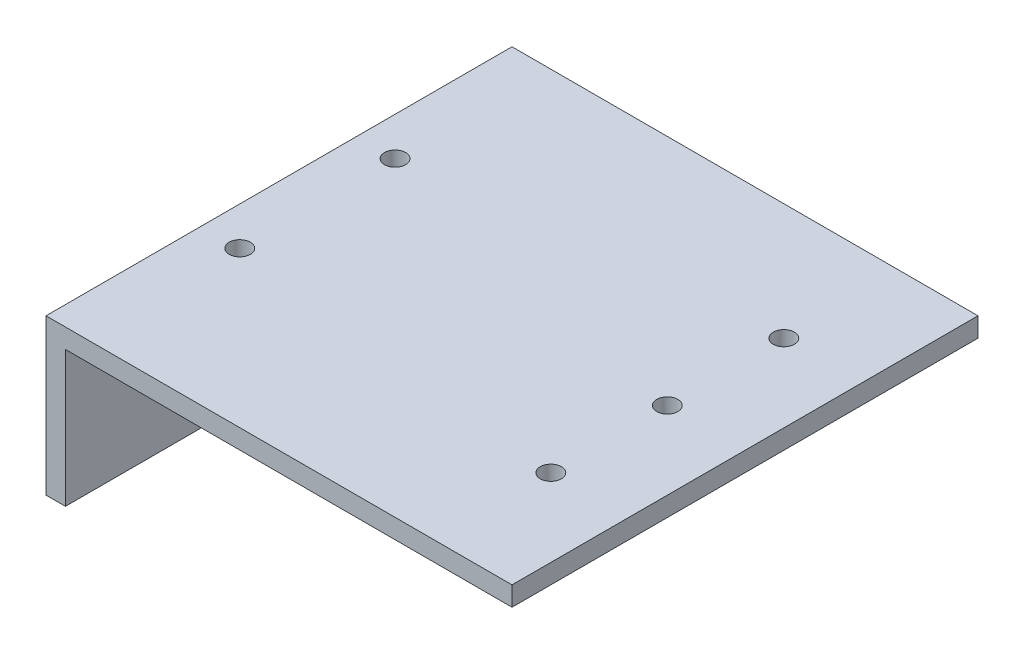
ISO-10303-21;
HEADER;
FILE_DESCRIPTION(('STEP AP214'),'2;1');
FILE_NAME('part.step','',(''),(''),'','','');
FILE_SCHEMA(('AUTOMOTIVE_DESIGN { 1 0 10303 214 1 1 1 1 }'));
ENDSEC;
DATA;
#1=APPLICATION_CONTEXT('core data for automotive mechanical design processes');
#2=APPLICATION_PROTOCOL_DEFINITION('international standard','automotive_design',2000,#1);
#3=PRODUCT_CONTEXT('',#1,'mechanical');
#4=PRODUCT('Part','Part','',(#3));
#5=PRODUCT_RELATED_PRODUCT_CATEGORY('part','',(#4));
#6=PRODUCT_DEFINITION_FORMATION('','',#4);
#7=PRODUCT_DEFINITION_CONTEXT('part definition',#1,'design');
#8=PRODUCT_DEFINITION('design','',#6,#7);
#9=PRODUCT_DEFINITION_SHAPE('','',#8);
#10=(LENGTH_UNIT() NAMED_UNIT(*) SI_UNIT(.MILLI.,.METRE.));
#11=(NAMED_UNIT(*) PLANE_ANGLE_UNIT() SI_UNIT($,.RADIAN.));
#12=(NAMED_UNIT(*) SI_UNIT($,.STERADIAN.) SOLID_ANGLE_UNIT());
#13=UNCERTAINTY_MEASURE_WITH_UNIT(LENGTH_MEASURE(1.E-05),#10,'distance_accuracy_value','');
#14=(GEOMETRIC_REPRESENTATION_CONTEXT(3) GLOBAL_UNCERTAINTY_ASSIGNED_CONTEXT((#13)) GLOBAL_UNIT_ASSIGNED_CONTEXT((#10,
#11,#12)) REPRESENTATION_CONTEXT('',''));
#15=CARTESIAN_POINT('',(0.,0.,0.));
#16=DIRECTION('',(0.,0.,1.));
#17=DIRECTION('',(1.,0.,0.));
#18=AXIS2_PLACEMENT_3D('',#15,#16,#17);
#19=CARTESIAN_POINT('',(0.,-3.17500000000001,76.2));
#20=DIRECTION('',(-1.,0.,0.));
#21=DIRECTION('',(0.,0.,1.));
#22=AXIS2_PLACEMENT_3D('',#19,#20,#21);
#23=PLANE('',#22);
#24=DIRECTION('',(0.,1.,0.));
#25=VECTOR('',#24,1.);
#26=CARTESIAN_POINT('',(0.,-3.17500000000001,0.));
#27=LINE('',#26,#25);
#28=CARTESIAN_POINT('',(0.,-3.17500000000001,0.));
#29=VERTEX_POINT('',#28);
#30=CARTESIAN_POINT('',(0.,0.,0.));
#31=VERTEX_POINT('',#30);
#32=EDGE_CURVE('E172',#29,#31,#27,.T.);
#33=ORIENTED_EDGE('',*,*,#32,.T.);
#34=DIRECTION('',(0.,0.,-1.));
#35=VECTOR('',#34,1.);
#36=CARTESIAN_POINT('',(0.,0.,76.2));
#37=LINE('',#36,#35);
#38=CARTESIAN_POINT('',(0.,0.,76.2));
#39=VERTEX_POINT('',#38);
#40=EDGE_CURVE('E11',#39,#31,#37,.T.);
#41=ORIENTED_EDGE('',*,*,#40,.F.);
#42=DIRECTION('',(0.,1.,0.));
#43=VECTOR('',#42,1.);
#44=CARTESIAN_POINT('',(0.,-3.17500000000001,76.2));
#45=LINE('',#44,#43);
#46=CARTESIAN_POINT('',(0.,-3.17500000000001,76.2));
#47=VERTEX_POINT('',#46);
#48=EDGE_CURVE('E173',#47,#39,#45,.T.);
#49=ORIENTED_EDGE('',*,*,#48,.F.);
#50=DIRECTION('',(0.,0.,-1.));
#51=VECTOR('',#50,1.);
#52=CARTESIAN_POINT('',(0.,-3.17500000000001,76.2));
#53=LINE('',#52,#51);
#54=EDGE_CURVE('E187',#47,#29,#53,.T.);
#55=ORIENTED_EDGE('',*,*,#54,.T.);
#56=EDGE_LOOP('',(#33,#41,#49,#55));
#57=FACE_BOUND('',#56,.T.);
#58=ADVANCED_FACE('F34',(#57),#23,.F.);
#59=CARTESIAN_POINT('',(0.,0.,76.2));
#60=DIRECTION('',(0.,-1.,0.));
#61=DIRECTION('',(1.,0.,0.));
#62=AXIS2_PLACEMENT_3D('',#59,#60,#61);
#63=PLANE('',#62);
#64=CARTESIAN_POINT('',(-12.7,0.,19.05));
#65=DIRECTION('',(0.,1.,0.));
#66=DIRECTION('',(0.,0.,1.));
#67=AXIS2_PLACEMENT_3D('',#64,#65,#66);
#68=CIRCLE('',#67,1.72719999999999);
#69=CARTESIAN_POINT('',(-12.7,0.,20.7772));
#70=VERTEX_POINT('',#69);
#71=EDGE_CURVE('E228',#70,#70,#68,.T.);
#72=ORIENTED_EDGE('',*,*,#71,.F.);
#73=EDGE_LOOP('',(#72));
#74=FACE_BOUND('',#73,.T.);
#75=CARTESIAN_POINT('',(-12.7,0.,38.1));
#76=DIRECTION('',(0.,1.,0.));
#77=DIRECTION('',(0.,0.,1.));
#78=AXIS2_PLACEMENT_3D('',#75,#76,#77);
#79=CIRCLE('',#78,1.72719999999999);
#80=CARTESIAN_POINT('',(-12.7,0.,39.8272));
#81=VERTEX_POINT('',#80);
#82=EDGE_CURVE('E221',#81,#81,#79,.T.);
#83=ORIENTED_EDGE('',*,*,#82,.F.);
#84=EDGE_LOOP('',(#83));
#85=FACE_BOUND('',#84,.T.);
#86=CARTESIAN_POINT('',(-12.7,0.,57.15));
#87=DIRECTION('',(0.,1.,0.));
#88=DIRECTION('',(0.,0.,1.));
#89=AXIS2_PLACEMENT_3D('',#86,#87,#88);
#90=CIRCLE('',#89,1.72719999999999);
#91=CARTESIAN_POINT('',(-12.7,0.,58.8772));
#92=VERTEX_POINT('',#91);
#93=EDGE_CURVE('E213',#92,#92,#90,.T.);
#94=ORIENTED_EDGE('',*,*,#93,.F.);
#95=EDGE_LOOP('',(#94));
#96=FACE_BOUND('',#95,.T.);
#97=CARTESIAN_POINT('',(-69.9177386123245,0.,25.4));
#98=DIRECTION('',(0.,1.,0.));
#99=DIRECTION('',(0.,0.,1.));
#100=AXIS2_PLACEMENT_3D('',#97,#98,#99);
#101=CIRCLE('',#100,1.7272);
#102=CARTESIAN_POINT('',(-69.9177386123245,0.,27.1272));
#103=VERTEX_POINT('',#102);
#104=EDGE_CURVE('E126',#103,#103,#101,.T.);
#105=ORIENTED_EDGE('',*,*,#104,.F.);
#106=EDGE_LOOP('',(#105));
#107=FACE_BOUND('',#106,.T.);
#108=CARTESIAN_POINT('',(-69.9177386123245,0.,50.8));
#109=DIRECTION('',(0.,1.,0.));
#110=DIRECTION('',(0.,0.,1.));
#111=AXIS2_PLACEMENT_3D('',#108,#109,#110);
#112=CIRCLE('',#111,1.7272);
#113=CARTESIAN_POINT('',(-69.9177386123245,0.,52.5272));
#114=VERTEX_POINT('',#113);
#115=EDGE_CURVE('E154',#114,#114,#112,.T.);
#116=ORIENTED_EDGE('',*,*,#115,.F.);
#117=EDGE_LOOP('',(#116));
#118=FACE_BOUND('',#117,.T.);
#119=DIRECTION('',(-1.,0.,0.));
#120=VECTOR('',#119,1.);
#121=CARTESIAN_POINT('',(0.,0.,0.));
#122=LINE('',#121,#120);
#123=CARTESIAN_POINT('',(-76.2,0.,0.));
#124=VERTEX_POINT('',#123);
#125=EDGE_CURVE('E190',#31,#124,#122,.T.);
#126=ORIENTED_EDGE('',*,*,#125,.T.);
#127=DIRECTION('',(0.,0.,-1.));
#128=VECTOR('',#127,1.);
#129=CARTESIAN_POINT('',(-76.2,0.,76.2));
#130=LINE('',#129,#128);
#131=CARTESIAN_POINT('',(-76.2,0.,76.2));
#132=VERTEX_POINT('',#131);
#133=EDGE_CURVE('E42',#132,#124,#130,.T.);
#134=ORIENTED_EDGE('',*,*,#133,.F.);
#135=DIRECTION('',(-1.,0.,0.));
#136=VECTOR('',#135,1.);
#137=CARTESIAN_POINT('',(0.,0.,76.2));
#138=LINE('',#137,#136);
#139=EDGE_CURVE('E176',#39,#132,#138,.T.);
#140=ORIENTED_EDGE('',*,*,#139,.F.);
#141=ORIENTED_EDGE('',*,*,#40,.T.);
#142=EDGE_LOOP('',(#126,#134,#140,#141));
#143=FACE_BOUND('',#142,.T.);
#144=ADVANCED_FACE('F235',(#74,#85,#96,#107,#118,#143),#63,.F.);
#145=CARTESIAN_POINT('',(-76.2,0.,76.2));
#146=DIRECTION('',(1.,0.,0.));
#147=DIRECTION('',(0.,0.,-1.));
#148=AXIS2_PLACEMENT_3D('',#145,#146,#147);
#149=PLANE('',#148);
#150=DIRECTION('',(0.,0.,-1.));
#151=VECTOR('',#150,1.);
#152=CARTESIAN_POINT('',(-76.2,-13.589,36.449));
#153=LINE('',#152,#151);
#154=CARTESIAN_POINT('',(-76.2,-13.589,39.751));
#155=VERTEX_POINT('',#154);
#156=CARTESIAN_POINT('',(-76.2,-13.589,36.449));
#157=VERTEX_POINT('',#156);
#158=EDGE_CURVE('E134',#155,#157,#153,.T.);
#159=ORIENTED_EDGE('',*,*,#158,.F.);
#160=DIRECTION('',(0.,1.,0.));
#161=VECTOR('',#160,1.);
#162=CARTESIAN_POINT('',(-76.2,-16.891,39.751));
#163=LINE('',#162,#161);
#164=CARTESIAN_POINT('',(-76.2,-16.891,39.751));
#165=VERTEX_POINT('',#164);
#166=EDGE_CURVE('E50',#165,#155,#163,.T.);
#167=ORIENTED_EDGE('',*,*,#166,.F.);
#168=DIRECTION('',(0.,0.,1.));
#169=VECTOR('',#168,1.);
#170=CARTESIAN_POINT('',(-76.2,-16.891,36.449));
#171=LINE('',#170,#169);
#172=CARTESIAN_POINT('',(-76.2,-16.891,36.449));
#173=VERTEX_POINT('',#172);
#174=EDGE_CURVE('E120',#173,#165,#171,.T.);
#175=ORIENTED_EDGE('',*,*,#174,.F.);
#176=DIRECTION('',(0.,-1.,0.));
#177=VECTOR('',#176,1.);
#178=CARTESIAN_POINT('',(-76.2,-16.891,36.449));
#179=LINE('',#178,#177);
#180=EDGE_CURVE('E140',#157,#173,#179,.T.);
#181=ORIENTED_EDGE('',*,*,#180,.F.);
#182=EDGE_LOOP('',(#159,#167,#175,#181));
#183=FACE_BOUND('',#182,.T.);
#184=CARTESIAN_POINT('',(-76.2,-15.24,25.4));
#185=DIRECTION('',(-1.,0.,0.));
#186=DIRECTION('',(0.,0.,1.));
#187=AXIS2_PLACEMENT_3D('',#184,#185,#186);
#188=CIRCLE('',#187,1.35255);
#189=CARTESIAN_POINT('',(-76.2,-15.24,26.75255));
#190=VERTEX_POINT('',#189);
#191=EDGE_CURVE('E160',#190,#190,#188,.T.);
#192=ORIENTED_EDGE('',*,*,#191,.F.);
#193=EDGE_LOOP('',(#192));
#194=FACE_BOUND('',#193,.T.);
#195=CARTESIAN_POINT('',(-76.2,-15.24,12.7));
#196=DIRECTION('',(-1.,0.,0.));
#197=DIRECTION('',(0.,0.,1.));
#198=AXIS2_PLACEMENT_3D('',#195,#196,#197);
#199=CIRCLE('',#198,1.35255);
#200=CARTESIAN_POINT('',(-76.2,-15.24,14.05255));
#201=VERTEX_POINT('',#200);
#202=EDGE_CURVE('E166',#201,#201,#199,.T.);
#203=ORIENTED_EDGE('',*,*,#202,.F.);
#204=EDGE_LOOP('',(#203));
#205=FACE_BOUND('',#204,.T.);
#206=DIRECTION('',(0.,-1.,0.));
#207=VECTOR('',#206,1.);
#208=CARTESIAN_POINT('',(-76.2,0.,0.));
#209=LINE('',#208,#207);
#210=CARTESIAN_POINT('',(-76.2,-25.4,0.));
#211=VERTEX_POINT('',#210);
#212=EDGE_CURVE('E192',#124,#211,#209,.T.);
#213=ORIENTED_EDGE('',*,*,#212,.T.);
#214=DIRECTION('',(0.,0.,-1.));
#215=VECTOR('',#214,1.);
#216=CARTESIAN_POINT('',(-76.2,-25.4,76.2));
#217=LINE('',#216,#215);
#218=CARTESIAN_POINT('',(-76.2,-25.4,76.2));
#219=VERTEX_POINT('',#218);
#220=EDGE_CURVE('E207',#219,#211,#217,.T.);
#221=ORIENTED_EDGE('',*,*,#220,.F.);
#222=DIRECTION('',(0.,-1.,0.));
#223=VECTOR('',#222,1.);
#224=CARTESIAN_POINT('',(-76.2,0.,76.2));
#225=LINE('',#224,#223);
#226=EDGE_CURVE('E179',#132,#219,#225,.T.);
#227=ORIENTED_EDGE('',*,*,#226,.F.);
#228=ORIENTED_EDGE('',*,*,#133,.T.);
#229=EDGE_LOOP('',(#213,#221,#227,#228));
#230=FACE_BOUND('',#229,.T.);
#231=ADVANCED_FACE('F238',(#183,#194,#205,#230),#149,.F.);
#232=CARTESIAN_POINT('',(-76.2,-25.4,76.2));
#233=DIRECTION('',(0.,1.,0.));
#234=DIRECTION('',(0.,0.,1.));
#235=AXIS2_PLACEMENT_3D('',#232,#233,#234);
#236=PLANE('',#235);
#237=DIRECTION('',(1.,0.,0.));
#238=VECTOR('',#237,1.);
#239=CARTESIAN_POINT('',(-76.2,-25.4,0.));
#240=LINE('',#239,#238);
#241=CARTESIAN_POINT('',(-73.025,-25.4,0.));
#242=VERTEX_POINT('',#241);
#243=EDGE_CURVE('E194',#211,#242,#240,.T.);
#244=ORIENTED_EDGE('',*,*,#243,.T.);
#245=DIRECTION('',(0.,0.,-1.));
#246=VECTOR('',#245,1.);
#247=CARTESIAN_POINT('',(-73.025,-25.4,76.2));
#248=LINE('',#247,#246);
#249=CARTESIAN_POINT('',(-73.025,-25.4,76.2));
#250=VERTEX_POINT('',#249);
#251=EDGE_CURVE('E204',#250,#242,#248,.T.);
#252=ORIENTED_EDGE('',*,*,#251,.F.);
#253=DIRECTION('',(1.,0.,0.));
#254=VECTOR('',#253,1.);
#255=CARTESIAN_POINT('',(-76.2,-25.4,76.2));
#256=LINE('',#255,#254);
#257=EDGE_CURVE('E181',#219,#250,#256,.T.);
#258=ORIENTED_EDGE('',*,*,#257,.F.);
#259=ORIENTED_EDGE('',*,*,#220,.T.);
#260=EDGE_LOOP('',(#244,#252,#258,#259));
#261=FACE_BOUND('',#260,.T.);
#262=ADVANCED_FACE('F260',(#261),#236,.F.);
#263=CARTESIAN_POINT('',(-73.025,-25.4,76.2));
#264=DIRECTION('',(-1.,0.,0.));
#265=DIRECTION('',(0.,0.,1.));
#266=AXIS2_PLACEMENT_3D('',#263,#264,#265);
#267=PLANE('',#266);
#268=DIRECTION('',(0.,0.,-1.));
#269=VECTOR('',#268,1.);
#270=CARTESIAN_POINT('',(-73.025,-16.891,36.449));
#271=LINE('',#270,#269);
#272=CARTESIAN_POINT('',(-73.025,-16.891,39.751));
#273=VERTEX_POINT('',#272);
#274=CARTESIAN_POINT('',(-73.025,-16.891,36.449));
#275=VERTEX_POINT('',#274);
#276=EDGE_CURVE('E132',#273,#275,#271,.T.);
#277=ORIENTED_EDGE('',*,*,#276,.F.);
#278=DIRECTION('',(0.,-1.,0.));
#279=VECTOR('',#278,1.);
#280=CARTESIAN_POINT('',(-73.025,-16.891,39.751));
#281=LINE('',#280,#279);
#282=CARTESIAN_POINT('',(-73.025,-13.589,39.751));
#283=VERTEX_POINT('',#282);
#284=EDGE_CURVE('E114',#283,#273,#281,.T.);
#285=ORIENTED_EDGE('',*,*,#284,.F.);
#286=DIRECTION('',(0.,0.,1.));
#287=VECTOR('',#286,1.);
#288=CARTESIAN_POINT('',(-73.025,-13.589,36.449));
#289=LINE('',#288,#287);
#290=CARTESIAN_POINT('',(-73.025,-13.589,36.449));
#291=VERTEX_POINT('',#290);
#292=EDGE_CURVE('E123',#291,#283,#289,.T.);
#293=ORIENTED_EDGE('',*,*,#292,.F.);
#294=DIRECTION('',(0.,1.,0.));
#295=VECTOR('',#294,1.);
#296=CARTESIAN_POINT('',(-73.025,-16.891,36.449));
#297=LINE('',#296,#295);
#298=EDGE_CURVE('E58',#275,#291,#297,.T.);
#299=ORIENTED_EDGE('',*,*,#298,.F.);
#300=EDGE_LOOP('',(#277,#285,#293,#299));
#301=FACE_BOUND('',#300,.T.);
#302=CARTESIAN_POINT('',(-73.025,-15.24,25.4));
#303=DIRECTION('',(-1.,0.,0.));
#304=DIRECTION('',(0.,0.,1.));
#305=AXIS2_PLACEMENT_3D('',#302,#303,#304);
#306=CIRCLE('',#305,1.35254999999999);
#307=CARTESIAN_POINT('',(-73.025,-15.24,26.75255));
#308=VERTEX_POINT('',#307);
#309=EDGE_CURVE('E163',#308,#308,#306,.T.);
#310=ORIENTED_EDGE('',*,*,#309,.T.);
#311=EDGE_LOOP('',(#310));
#312=FACE_BOUND('',#311,.T.);
#313=CARTESIAN_POINT('',(-73.025,-15.24,12.7));
#314=DIRECTION('',(-1.,0.,0.));
#315=DIRECTION('',(0.,0.,1.));
#316=AXIS2_PLACEMENT_3D('',#313,#314,#315);
#317=CIRCLE('',#316,1.35254999999999);
#318=CARTESIAN_POINT('',(-73.025,-15.24,14.05255));
#319=VERTEX_POINT('',#318);
#320=EDGE_CURVE('E169',#319,#319,#317,.T.);
#321=ORIENTED_EDGE('',*,*,#320,.T.);
#322=EDGE_LOOP('',(#321));
#323=FACE_BOUND('',#322,.T.);
#324=DIRECTION('',(0.,1.,0.));
#325=VECTOR('',#324,1.);
#326=CARTESIAN_POINT('',(-73.025,-25.4,0.));
#327=LINE('',#326,#325);
#328=CARTESIAN_POINT('',(-73.025,-3.17500000000001,0.));
#329=VERTEX_POINT('',#328);
#330=EDGE_CURVE('E196',#242,#329,#327,.T.);
#331=ORIENTED_EDGE('',*,*,#330,.T.);
#332=DIRECTION('',(0.,0.,-1.));
#333=VECTOR('',#332,1.);
#334=CARTESIAN_POINT('',(-73.025,-3.17500000000001,76.2));
#335=LINE('',#334,#333);
#336=CARTESIAN_POINT('',(-73.025,-3.17500000000001,76.2));
#337=VERTEX_POINT('',#336);
#338=EDGE_CURVE('E201',#337,#329,#335,.T.);
#339=ORIENTED_EDGE('',*,*,#338,.F.);
#340=DIRECTION('',(0.,1.,0.));
#341=VECTOR('',#340,1.);
#342=CARTESIAN_POINT('',(-73.025,-25.4,76.2));
#343=LINE('',#342,#341);
#344=EDGE_CURVE('E183',#250,#337,#343,.T.);
#345=ORIENTED_EDGE('',*,*,#344,.F.);
#346=ORIENTED_EDGE('',*,*,#251,.T.);
#347=EDGE_LOOP('',(#331,#339,#345,#346));
#348=FACE_BOUND('',#347,.T.);
#349=ADVANCED_FACE('F129',(#301,#312,#323,#348),#267,.F.);
#350=CARTESIAN_POINT('',(-73.025,-3.17500000000001,76.2));
#351=DIRECTION('',(0.,1.,0.));
#352=DIRECTION('',(-1.,0.,0.));
#353=AXIS2_PLACEMENT_3D('',#350,#351,#352);
#354=PLANE('',#353);
#355=CARTESIAN_POINT('',(-12.7,-3.17500000000001,19.05));
#356=DIRECTION('',(0.,1.,0.));
#357=DIRECTION('',(-1.,0.,0.));
#358=AXIS2_PLACEMENT_3D('',#355,#356,#357);
#359=CIRCLE('',#358,1.72719999999999);
#360=CARTESIAN_POINT('',(-14.4272,-3.17500000000001,19.05));
#361=VERTEX_POINT('',#360);
#362=EDGE_CURVE('E225',#361,#361,#359,.T.);
#363=ORIENTED_EDGE('',*,*,#362,.T.);
#364=EDGE_LOOP('',(#363));
#365=FACE_BOUND('',#364,.T.);
#366=CARTESIAN_POINT('',(-12.7,-3.17500000000001,38.1));
#367=DIRECTION('',(0.,1.,0.));
#368=DIRECTION('',(-1.,0.,0.));
#369=AXIS2_PLACEMENT_3D('',#366,#367,#368);
#370=CIRCLE('',#369,1.72719999999999);
#371=CARTESIAN_POINT('',(-14.4272,-3.17500000000001,38.1));
#372=VERTEX_POINT('',#371);
#373=EDGE_CURVE('E37',#372,#372,#370,.T.);
#374=ORIENTED_EDGE('',*,*,#373,.T.);
#375=EDGE_LOOP('',(#374));
#376=FACE_BOUND('',#375,.T.);
#377=CARTESIAN_POINT('',(-12.7,-3.17500000000001,57.15));
#378=DIRECTION('',(0.,1.,0.));
#379=DIRECTION('',(-1.,0.,0.));
#380=AXIS2_PLACEMENT_3D('',#377,#378,#379);
#381=CIRCLE('',#380,1.72719999999999);
#382=CARTESIAN_POINT('',(-14.4272,-3.17500000000001,57.15));
#383=VERTEX_POINT('',#382);
#384=EDGE_CURVE('E211',#383,#383,#381,.T.);
#385=ORIENTED_EDGE('',*,*,#384,.T.);
#386=EDGE_LOOP('',(#385));
#387=FACE_BOUND('',#386,.T.);
#388=CARTESIAN_POINT('',(-69.9177386123245,-3.17500000000001,25.4));
#389=DIRECTION('',(0.,1.,0.));
#390=DIRECTION('',(-1.,0.,0.));
#391=AXIS2_PLACEMENT_3D('',#388,#389,#390);
#392=CIRCLE('',#391,1.7272);
#393=CARTESIAN_POINT('',(-71.6449386123245,-3.17500000000001,25.4));
#394=VERTEX_POINT('',#393);
#395=EDGE_CURVE('E151',#394,#394,#392,.T.);
#396=ORIENTED_EDGE('',*,*,#395,.T.);
#397=EDGE_LOOP('',(#396));
#398=FACE_BOUND('',#397,.T.);
#399=CARTESIAN_POINT('',(-69.9177386123245,-3.17500000000001,50.8));
#400=DIRECTION('',(0.,1.,0.));
#401=DIRECTION('',(-1.,0.,0.));
#402=AXIS2_PLACEMENT_3D('',#399,#400,#401);
#403=CIRCLE('',#402,1.7272);
#404=CARTESIAN_POINT('',(-71.6449386123245,-3.17500000000001,50.8));
#405=VERTEX_POINT('',#404);
#406=EDGE_CURVE('E157',#405,#405,#403,.T.);
#407=ORIENTED_EDGE('',*,*,#406,.T.);
#408=EDGE_LOOP('',(#407));
#409=FACE_BOUND('',#408,.T.);
#410=DIRECTION('',(1.,0.,0.));
#411=VECTOR('',#410,1.);
#412=CARTESIAN_POINT('',(-73.025,-3.17500000000001,0.));
#413=LINE('',#412,#411);
#414=EDGE_CURVE('E177',#329,#29,#413,.T.);
#415=ORIENTED_EDGE('',*,*,#414,.T.);
#416=ORIENTED_EDGE('',*,*,#54,.F.);
#417=DIRECTION('',(1.,0.,0.));
#418=VECTOR('',#417,1.);
#419=CARTESIAN_POINT('',(-73.025,-3.17500000000001,76.2));
#420=LINE('',#419,#418);
#421=EDGE_CURVE('E185',#337,#47,#420,.T.);
#422=ORIENTED_EDGE('',*,*,#421,.F.);
#423=ORIENTED_EDGE('',*,*,#338,.T.);
#424=EDGE_LOOP('',(#415,#416,#422,#423));
#425=FACE_BOUND('',#424,.T.);
#426=ADVANCED_FACE('F272',(#365,#376,#387,#398,#409,#425),#354,.F.);
#427=CARTESIAN_POINT('',(0.,0.,76.2));
#428=DIRECTION('',(0.,0.,1.));
#429=DIRECTION('',(1.,0.,0.));
#430=AXIS2_PLACEMENT_3D('',#427,#428,#429);
#431=PLANE('',#430);
#432=ORIENTED_EDGE('',*,*,#48,.T.);
#433=ORIENTED_EDGE('',*,*,#139,.T.);
#434=ORIENTED_EDGE('',*,*,#226,.T.);
#435=ORIENTED_EDGE('',*,*,#257,.T.);
#436=ORIENTED_EDGE('',*,*,#344,.T.);
#437=ORIENTED_EDGE('',*,*,#421,.T.);
#438=EDGE_LOOP('',(#432,#433,#434,#435,#436,#437));
#439=FACE_BOUND('',#438,.T.);
#440=ADVANCED_FACE('F267',(#439),#431,.T.);
#441=CARTESIAN_POINT('',(0.,0.,0.));
#442=DIRECTION('',(0.,0.,1.));
#443=DIRECTION('',(1.,0.,0.));
#444=AXIS2_PLACEMENT_3D('',#441,#442,#443);
#445=PLANE('',#444);
#446=ORIENTED_EDGE('',*,*,#32,.F.);
#447=ORIENTED_EDGE('',*,*,#414,.F.);
#448=ORIENTED_EDGE('',*,*,#330,.F.);
#449=ORIENTED_EDGE('',*,*,#243,.F.);
#450=ORIENTED_EDGE('',*,*,#212,.F.);
#451=ORIENTED_EDGE('',*,*,#125,.F.);
#452=EDGE_LOOP('',(#446,#447,#448,#449,#450,#451));
#453=FACE_BOUND('',#452,.T.);
#454=ADVANCED_FACE('F255',(#453),#445,.F.);
#455=CARTESIAN_POINT('',(-76.2,-15.24,12.7));
#456=DIRECTION('',(-1.,0.,0.));
#457=DIRECTION('',(0.,0.,1.));
#458=AXIS2_PLACEMENT_3D('',#455,#456,#457);
#459=CYLINDRICAL_SURFACE('',#458,1.35254999999999);
#460=ORIENTED_EDGE('',*,*,#202,.T.);
#461=EDGE_LOOP('',(#460));
#462=FACE_BOUND('',#461,.T.);
#463=ORIENTED_EDGE('',*,*,#320,.F.);
#464=EDGE_LOOP('',(#463));
#465=FACE_BOUND('',#464,.T.);
#466=ADVANCED_FACE('F332',(#462,#465),#459,.F.);
#467=CARTESIAN_POINT('',(-76.2,-15.24,25.4));
#468=DIRECTION('',(-1.,0.,0.));
#469=DIRECTION('',(0.,0.,1.));
#470=AXIS2_PLACEMENT_3D('',#467,#468,#469);
#471=CYLINDRICAL_SURFACE('',#470,1.35254999999999);
#472=ORIENTED_EDGE('',*,*,#191,.T.);
#473=EDGE_LOOP('',(#472));
#474=FACE_BOUND('',#473,.T.);
#475=ORIENTED_EDGE('',*,*,#309,.F.);
#476=EDGE_LOOP('',(#475));
#477=FACE_BOUND('',#476,.T.);
#478=ADVANCED_FACE('F338',(#474,#477),#471,.F.);
#479=CARTESIAN_POINT('',(-69.9177386123245,0.,50.8));
#480=DIRECTION('',(0.,1.,0.));
#481=DIRECTION('',(0.,0.,1.));
#482=AXIS2_PLACEMENT_3D('',#479,#480,#481);
#483=CYLINDRICAL_SURFACE('',#482,1.7272);
#484=ORIENTED_EDGE('',*,*,#115,.T.);
#485=EDGE_LOOP('',(#484));
#486=FACE_BOUND('',#485,.T.);
#487=ORIENTED_EDGE('',*,*,#406,.F.);
#488=EDGE_LOOP('',(#487));
#489=FACE_BOUND('',#488,.T.);
#490=ADVANCED_FACE('F346',(#486,#489),#483,.F.);
#491=CARTESIAN_POINT('',(-69.9177386123245,0.,25.4));
#492=DIRECTION('',(0.,1.,0.));
#493=DIRECTION('',(0.,0.,1.));
#494=AXIS2_PLACEMENT_3D('',#491,#492,#493);
#495=CYLINDRICAL_SURFACE('',#494,1.7272);
#496=ORIENTED_EDGE('',*,*,#104,.T.);
#497=EDGE_LOOP('',(#496));
#498=FACE_BOUND('',#497,.T.);
#499=ORIENTED_EDGE('',*,*,#395,.F.);
#500=EDGE_LOOP('',(#499));
#501=FACE_BOUND('',#500,.T.);
#502=ADVANCED_FACE('F354',(#498,#501),#495,.F.);
#503=CARTESIAN_POINT('',(0.001000000000001,-16.891,39.751));
#504=DIRECTION('',(0.,0.,1.));
#505=DIRECTION('',(1.,0.,0.));
#506=AXIS2_PLACEMENT_3D('',#503,#504,#505);
#507=PLANE('',#506);
#508=ORIENTED_EDGE('',*,*,#284,.T.);
#509=DIRECTION('',(-1.,0.,0.));
#510=VECTOR('',#509,1.);
#511=CARTESIAN_POINT('',(0.001000000000001,-16.891,39.751));
#512=LINE('',#511,#510);
#513=EDGE_CURVE('E127',#273,#165,#512,.T.);
#514=ORIENTED_EDGE('',*,*,#513,.T.);
#515=ORIENTED_EDGE('',*,*,#166,.T.);
#516=DIRECTION('',(-1.,0.,0.));
#517=VECTOR('',#516,1.);
#518=CARTESIAN_POINT('',(0.001000000000001,-13.589,39.751));
#519=LINE('',#518,#517);
#520=EDGE_CURVE('E110',#283,#155,#519,.T.);
#521=ORIENTED_EDGE('',*,*,#520,.F.);
#522=EDGE_LOOP('',(#508,#514,#515,#521));
#523=FACE_BOUND('',#522,.T.);
#524=ADVANCED_FACE('F112',(#523),#507,.F.);
#525=CARTESIAN_POINT('',(0.001000000000001,-16.891,36.449));
#526=DIRECTION('',(0.,-1.,0.));
#527=DIRECTION('',(0.,0.,-1.));
#528=AXIS2_PLACEMENT_3D('',#525,#526,#527);
#529=PLANE('',#528);
#530=ORIENTED_EDGE('',*,*,#276,.T.);
#531=DIRECTION('',(-1.,0.,0.));
#532=VECTOR('',#531,1.);
#533=CARTESIAN_POINT('',(0.001000000000001,-16.891,36.449));
#534=LINE('',#533,#532);
#535=EDGE_CURVE('E146',#275,#173,#534,.T.);
#536=ORIENTED_EDGE('',*,*,#535,.T.);
#537=ORIENTED_EDGE('',*,*,#174,.T.);
#538=ORIENTED_EDGE('',*,*,#513,.F.);
#539=EDGE_LOOP('',(#530,#536,#537,#538));
#540=FACE_BOUND('',#539,.T.);
#541=ADVANCED_FACE('F367',(#540),#529,.F.);
#542=CARTESIAN_POINT('',(0.001000000000001,-16.891,36.449));
#543=DIRECTION('',(0.,0.,-1.));
#544=DIRECTION('',(-1.,0.,0.));
#545=AXIS2_PLACEMENT_3D('',#542,#543,#544);
#546=PLANE('',#545);
#547=ORIENTED_EDGE('',*,*,#298,.T.);
#548=DIRECTION('',(-1.,0.,0.));
#549=VECTOR('',#548,1.);
#550=CARTESIAN_POINT('',(0.001000000000001,-13.589,36.449));
#551=LINE('',#550,#549);
#552=EDGE_CURVE('E119',#291,#157,#551,.T.);
#553=ORIENTED_EDGE('',*,*,#552,.T.);
#554=ORIENTED_EDGE('',*,*,#180,.T.);
#555=ORIENTED_EDGE('',*,*,#535,.F.);
#556=EDGE_LOOP('',(#547,#553,#554,#555));
#557=FACE_BOUND('',#556,.T.);
#558=ADVANCED_FACE('F374',(#557),#546,.F.);
#559=CARTESIAN_POINT('',(0.001000000000001,-13.589,36.449));
#560=DIRECTION('',(0.,1.,0.));
#561=DIRECTION('',(0.,0.,1.));
#562=AXIS2_PLACEMENT_3D('',#559,#560,#561);
#563=PLANE('',#562);
#564=ORIENTED_EDGE('',*,*,#292,.T.);
#565=ORIENTED_EDGE('',*,*,#520,.T.);
#566=ORIENTED_EDGE('',*,*,#158,.T.);
#567=ORIENTED_EDGE('',*,*,#552,.F.);
#568=EDGE_LOOP('',(#564,#565,#566,#567));
#569=FACE_BOUND('',#568,.T.);
#570=ADVANCED_FACE('F124',(#569),#563,.F.);
#571=CARTESIAN_POINT('',(-12.7,0.,57.15));
#572=DIRECTION('',(0.,1.,0.));
#573=DIRECTION('',(0.,0.,1.));
#574=AXIS2_PLACEMENT_3D('',#571,#572,#573);
#575=CYLINDRICAL_SURFACE('',#574,1.72719999999999);
#576=ORIENTED_EDGE('',*,*,#93,.T.);
#577=EDGE_LOOP('',(#576));
#578=FACE_BOUND('',#577,.T.);
#579=ORIENTED_EDGE('',*,*,#384,.F.);
#580=EDGE_LOOP('',(#579));
#581=FACE_BOUND('',#580,.T.);
#582=ADVANCED_FACE('F387',(#578,#581),#575,.F.);
#583=CARTESIAN_POINT('',(-12.7,0.,38.1));
#584=DIRECTION('',(0.,1.,0.));
#585=DIRECTION('',(0.,0.,1.));
#586=AXIS2_PLACEMENT_3D('',#583,#584,#585);
#587=CYLINDRICAL_SURFACE('',#586,1.72719999999999);
#588=ORIENTED_EDGE('',*,*,#82,.T.);
#589=EDGE_LOOP('',(#588));
#590=FACE_BOUND('',#589,.T.);
#591=ORIENTED_EDGE('',*,*,#373,.F.);
#592=EDGE_LOOP('',(#591));
#593=FACE_BOUND('',#592,.T.);
#594=ADVANCED_FACE('F393',(#590,#593),#587,.F.);
#595=CARTESIAN_POINT('',(-12.7,0.,19.05));
#596=DIRECTION('',(0.,1.,0.));
#597=DIRECTION('',(0.,0.,1.));
#598=AXIS2_PLACEMENT_3D('',#595,#596,#597);
#599=CYLINDRICAL_SURFACE('',#598,1.72719999999999);
#600=ORIENTED_EDGE('',*,*,#71,.T.);
#601=EDGE_LOOP('',(#600));
#602=FACE_BOUND('',#601,.T.);
#603=ORIENTED_EDGE('',*,*,#362,.F.);
#604=EDGE_LOOP('',(#603));
#605=FACE_BOUND('',#604,.T.);
#606=ADVANCED_FACE('F232',(#602,#605),#599,.F.);
#607=CLOSED_SHELL('',(#58,#144,#231,#262,#349,#426,#440,#454,#466,#478,#490,#502,#524,#541,#558,
#570,#582,#594,#606));
#608=MANIFOLD_SOLID_BREP('B2',#607);
#609=ADVANCED_BREP_SHAPE_REPRESENTATION('',(#18,#608),#14);
#610=SHAPE_DEFINITION_REPRESENTATION(#9,#609);
ENDSEC;
END-ISO-10303-21;
